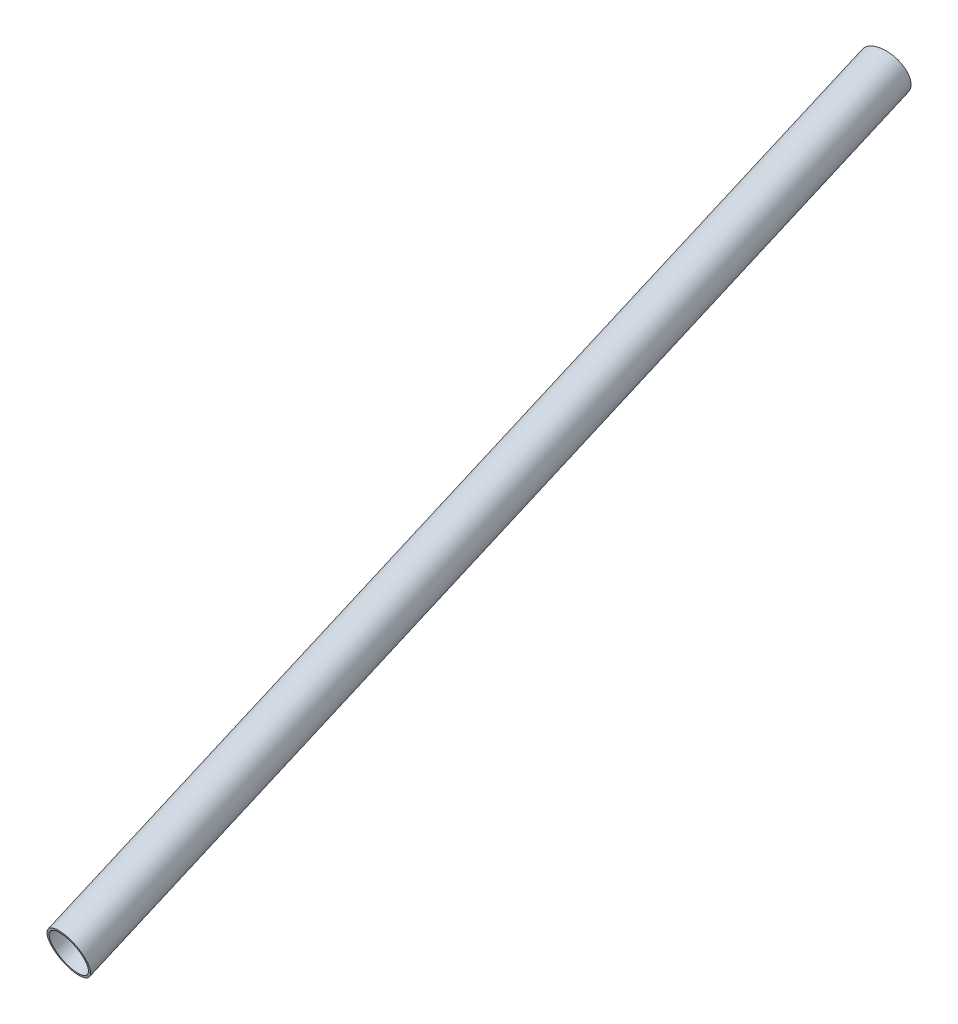
ISO-10303-21;
HEADER;
FILE_DESCRIPTION(('STEP AP214'),'2;1');
FILE_NAME('part.step','',(''),(''),'','','');
FILE_SCHEMA(('AUTOMOTIVE_DESIGN { 1 0 10303 214 1 1 1 1 }'));
ENDSEC;
DATA;
#1=APPLICATION_CONTEXT('core data for automotive mechanical design processes');
#2=APPLICATION_PROTOCOL_DEFINITION('international standard','automotive_design',2000,#1);
#3=PRODUCT_CONTEXT('',#1,'mechanical');
#4=PRODUCT('Part','Part','',(#3));
#5=PRODUCT_RELATED_PRODUCT_CATEGORY('part','',(#4));
#6=PRODUCT_DEFINITION_FORMATION('','',#4);
#7=PRODUCT_DEFINITION_CONTEXT('part definition',#1,'design');
#8=PRODUCT_DEFINITION('design','',#6,#7);
#9=PRODUCT_DEFINITION_SHAPE('','',#8);
#10=(LENGTH_UNIT() NAMED_UNIT(*) SI_UNIT(.MILLI.,.METRE.));
#11=(NAMED_UNIT(*) PLANE_ANGLE_UNIT() SI_UNIT($,.RADIAN.));
#12=(NAMED_UNIT(*) SI_UNIT($,.STERADIAN.) SOLID_ANGLE_UNIT());
#13=UNCERTAINTY_MEASURE_WITH_UNIT(LENGTH_MEASURE(1.E-05),#10,'distance_accuracy_value','');
#14=(GEOMETRIC_REPRESENTATION_CONTEXT(3) GLOBAL_UNCERTAINTY_ASSIGNED_CONTEXT((#13)) GLOBAL_UNIT_ASSIGNED_CONTEXT((#10,
#11,#12)) REPRESENTATION_CONTEXT('',''));
#15=CARTESIAN_POINT('',(0.,0.,0.));
#16=DIRECTION('',(0.,0.,1.));
#17=DIRECTION('',(1.,0.,0.));
#18=AXIS2_PLACEMENT_3D('',#15,#16,#17);
#19=CARTESIAN_POINT('',(-80.,380.,-601.037933611912));
#20=DIRECTION('',(-0.143388493553694,0.215082740330541,-0.966011984774676));
#21=DIRECTION('',(0.,0.976098519192531,0.21732850901377));
#22=AXIS2_PLACEMENT_3D('',#19,#20,#21);
#23=CYLINDRICAL_SURFACE('',#22,11.3);
#24=CARTESIAN_POINT('',(-160.,500.,-1140.));
#25=DIRECTION('',(0.143388493553694,-0.215082740330541,0.966011984774676));
#26=DIRECTION('',(0.989542149161439,0.0156867762578422,-0.143388493553694));
#27=AXIS2_PLACEMENT_3D('',#24,#25,#26);
#28=CIRCLE('',#27,11.3);
#29=CARTESIAN_POINT('',(-148.818173714476,500.177260571714,-1141.62028997716));
#30=VERTEX_POINT('',#29);
#31=EDGE_CURVE('E47',#30,#30,#28,.T.);
#32=ORIENTED_EDGE('',*,*,#31,.F.);
#33=EDGE_LOOP('',(#32));
#34=FACE_BOUND('',#33,.T.);
#35=CARTESIAN_POINT('',(-79.9999999999999,380.,-601.037933611912));
#36=DIRECTION('',(-0.0877040448988901,-0.311824264686693,0.946083309471727));
#37=DIRECTION('',(-0.915766996856785,-0.348518707826595,-0.199763654759287));
#38=AXIS2_PLACEMENT_3D('',#35,#36,#37);
#39=ELLIPSE('',#38,11.6684899557684,11.3);
#40=CARTESIAN_POINT('',(-90.6856180046476,375.933312958328,-603.368873810998));
#41=VERTEX_POINT('',#40);
#42=EDGE_CURVE('E43',#41,#41,#39,.T.);
#43=ORIENTED_EDGE('',*,*,#42,.T.);
#44=EDGE_LOOP('',(#43));
#45=FACE_BOUND('',#44,.T.);
#46=ADVANCED_FACE('F39',(#34,#45),#23,.F.);
#47=CARTESIAN_POINT('',(-80.,380.,-601.037933611912));
#48=DIRECTION('',(-0.143388493553694,0.215082740330541,-0.966011984774676));
#49=DIRECTION('',(0.,0.976098519192531,0.21732850901377));
#50=AXIS2_PLACEMENT_3D('',#47,#48,#49);
#51=CYLINDRICAL_SURFACE('',#50,12.5);
#52=CARTESIAN_POINT('',(-160.,500.,-1140.));
#53=DIRECTION('',(0.143388493553694,-0.215082740330541,0.966011984774676));
#54=DIRECTION('',(0.989542149161439,0.0156867762578422,-0.143388493553694));
#55=AXIS2_PLACEMENT_3D('',#52,#53,#54);
#56=CIRCLE('',#55,12.5);
#57=CARTESIAN_POINT('',(-147.630723135482,500.196084703223,-1141.79235616942));
#58=VERTEX_POINT('',#57);
#59=EDGE_CURVE('E51',#58,#58,#56,.T.);
#60=ORIENTED_EDGE('',*,*,#59,.T.);
#61=EDGE_LOOP('',(#60));
#62=FACE_BOUND('',#61,.T.);
#63=CARTESIAN_POINT('',(-79.9999999999999,380.,-601.037933611912));
#64=DIRECTION('',(-0.0877040448988901,-0.311824264686693,0.946083309471727));
#65=DIRECTION('',(-0.915766996856785,-0.348518707826595,-0.199763654759287));
#66=AXIS2_PLACEMENT_3D('',#63,#64,#65);
#67=ELLIPSE('',#66,12.9076216324872,12.5);
#68=CARTESIAN_POINT('',(-91.8203738989464,375.501452387531,-603.616407283468));
#69=VERTEX_POINT('',#68);
#70=EDGE_CURVE('E10',#69,#69,#67,.T.);
#71=ORIENTED_EDGE('',*,*,#70,.F.);
#72=EDGE_LOOP('',(#71));
#73=FACE_BOUND('',#72,.T.);
#74=ADVANCED_FACE('F66',(#62,#73),#51,.T.);
#75=CARTESIAN_POINT('',(-160.,500.,-1140.));
#76=DIRECTION('',(0.143388493553694,-0.215082740330541,0.966011984774676));
#77=DIRECTION('',(0.989542149161439,0.0156867762578422,-0.143388493553694));
#78=AXIS2_PLACEMENT_3D('',#75,#76,#77);
#79=PLANE('',#78);
#80=ORIENTED_EDGE('',*,*,#31,.T.);
#81=EDGE_LOOP('',(#80));
#82=FACE_BOUND('',#81,.T.);
#83=ORIENTED_EDGE('',*,*,#59,.F.);
#84=EDGE_LOOP('',(#83));
#85=FACE_BOUND('',#84,.T.);
#86=ADVANCED_FACE('F62',(#82,#85),#79,.F.);
#87=CARTESIAN_POINT('',(-80.,380.,-601.037933611912));
#88=DIRECTION('',(-0.0877040448988901,-0.311824264686693,0.946083309471727));
#89=DIRECTION('',(0.,-0.949743072396233,-0.313030504001389));
#90=AXIS2_PLACEMENT_3D('',#87,#88,#89);
#91=PLANE('',#90);
#92=ORIENTED_EDGE('',*,*,#42,.F.);
#93=EDGE_LOOP('',(#92));
#94=FACE_BOUND('',#93,.T.);
#95=ORIENTED_EDGE('',*,*,#70,.T.);
#96=EDGE_LOOP('',(#95));
#97=FACE_BOUND('',#96,.T.);
#98=ADVANCED_FACE('F41',(#94,#97),#91,.T.);
#99=CLOSED_SHELL('',(#46,#74,#86,#98));
#100=MANIFOLD_SOLID_BREP('B2',#99);
#101=ADVANCED_BREP_SHAPE_REPRESENTATION('',(#18,#100),#14);
#102=SHAPE_DEFINITION_REPRESENTATION(#9,#101);
ENDSEC;
END-ISO-10303-21;
